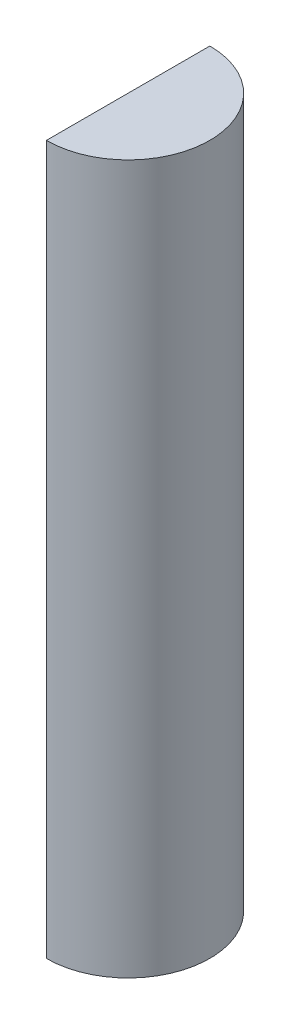
ISO-10303-21;
HEADER;
FILE_DESCRIPTION(('STEP AP214'),'2;1');
FILE_NAME('part.step','',(''),(''),'','','');
FILE_SCHEMA(('AUTOMOTIVE_DESIGN { 1 0 10303 214 1 1 1 1 }'));
ENDSEC;
DATA;
#1=APPLICATION_CONTEXT('core data for automotive mechanical design processes');
#2=APPLICATION_PROTOCOL_DEFINITION('international standard','automotive_design',2000,#1);
#3=PRODUCT_CONTEXT('',#1,'mechanical');
#4=PRODUCT('Part','Part','',(#3));
#5=PRODUCT_RELATED_PRODUCT_CATEGORY('part','',(#4));
#6=PRODUCT_DEFINITION_FORMATION('','',#4);
#7=PRODUCT_DEFINITION_CONTEXT('part definition',#1,'design');
#8=PRODUCT_DEFINITION('design','',#6,#7);
#9=PRODUCT_DEFINITION_SHAPE('','',#8);
#10=(LENGTH_UNIT() NAMED_UNIT(*) SI_UNIT(.MILLI.,.METRE.));
#11=(NAMED_UNIT(*) PLANE_ANGLE_UNIT() SI_UNIT($,.RADIAN.));
#12=(NAMED_UNIT(*) SI_UNIT($,.STERADIAN.) SOLID_ANGLE_UNIT());
#13=UNCERTAINTY_MEASURE_WITH_UNIT(LENGTH_MEASURE(1.E-05),#10,'distance_accuracy_value','');
#14=(GEOMETRIC_REPRESENTATION_CONTEXT(3) GLOBAL_UNCERTAINTY_ASSIGNED_CONTEXT((#13)) GLOBAL_UNIT_ASSIGNED_CONTEXT((#10,
#11,#12)) REPRESENTATION_CONTEXT('',''));
#15=CARTESIAN_POINT('',(0.,0.,0.));
#16=DIRECTION('',(0.,0.,1.));
#17=DIRECTION('',(1.,0.,0.));
#18=AXIS2_PLACEMENT_3D('',#15,#16,#17);
#19=CARTESIAN_POINT('',(1.524,19.05,6.35));
#20=DIRECTION('',(0.,1.,0.));
#21=DIRECTION('',(0.,0.,1.));
#22=AXIS2_PLACEMENT_3D('',#19,#20,#21);
#23=PLANE('',#22);
#24=DIRECTION('',(0.,0.,1.));
#25=VECTOR('',#24,1.);
#26=CARTESIAN_POINT('',(1.524,19.05,8.73125));
#27=LINE('',#26,#25);
#28=CARTESIAN_POINT('',(1.524,19.05,3.96875));
#29=VERTEX_POINT('',#28);
#30=CARTESIAN_POINT('',(1.524,19.05,8.73125));
#31=VERTEX_POINT('',#30);
#32=EDGE_CURVE('E56',#29,#31,#27,.T.);
#33=ORIENTED_EDGE('',*,*,#32,.T.);
#34=CARTESIAN_POINT('',(1.524,19.05,6.35));
#35=DIRECTION('',(0.,-1.,0.));
#36=DIRECTION('',(0.,0.,-1.));
#37=AXIS2_PLACEMENT_3D('',#34,#35,#36);
#38=CIRCLE('',#37,2.38125);
#39=EDGE_CURVE('E45',#29,#31,#38,.T.);
#40=ORIENTED_EDGE('',*,*,#39,.F.);
#41=EDGE_LOOP('',(#33,#40));
#42=FACE_BOUND('',#41,.T.);
#43=ADVANCED_FACE('F37',(#42),#23,.T.);
#44=CARTESIAN_POINT('',(1.524,19.05,6.35));
#45=DIRECTION('',(0.,-1.,0.));
#46=DIRECTION('',(0.,0.,-1.));
#47=AXIS2_PLACEMENT_3D('',#44,#45,#46);
#48=CYLINDRICAL_SURFACE('',#47,2.38125);
#49=CARTESIAN_POINT('',(1.524,-1.5875,6.35));
#50=DIRECTION('',(0.,-1.,0.));
#51=DIRECTION('',(0.,0.,-1.));
#52=AXIS2_PLACEMENT_3D('',#49,#50,#51);
#53=CIRCLE('',#52,2.38125);
#54=CARTESIAN_POINT('',(1.524,-1.5875,3.96875));
#55=VERTEX_POINT('',#54);
#56=CARTESIAN_POINT('',(1.524,-1.5875,8.73125));
#57=VERTEX_POINT('',#56);
#58=EDGE_CURVE('E69',#55,#57,#53,.T.);
#59=ORIENTED_EDGE('',*,*,#58,.F.);
#60=DIRECTION('',(0.,-1.,0.));
#61=VECTOR('',#60,1.);
#62=CARTESIAN_POINT('',(1.524,19.05,3.96875));
#63=LINE('',#62,#61);
#64=EDGE_CURVE('E51',#55,#29,#63,.F.);
#65=ORIENTED_EDGE('',*,*,#64,.T.);
#66=ORIENTED_EDGE('',*,*,#39,.T.);
#67=DIRECTION('',(0.,-1.,0.));
#68=VECTOR('',#67,1.);
#69=CARTESIAN_POINT('',(1.524,19.05,8.73125));
#70=LINE('',#69,#68);
#71=EDGE_CURVE('E62',#31,#57,#70,.T.);
#72=ORIENTED_EDGE('',*,*,#71,.T.);
#73=EDGE_LOOP('',(#59,#65,#66,#72));
#74=FACE_BOUND('',#73,.T.);
#75=ADVANCED_FACE('F68',(#74),#48,.T.);
#76=CARTESIAN_POINT('',(1.524,-1.5875,6.35));
#77=DIRECTION('',(0.,-1.,0.));
#78=DIRECTION('',(0.,0.,-1.));
#79=AXIS2_PLACEMENT_3D('',#76,#77,#78);
#80=PLANE('',#79);
#81=DIRECTION('',(0.,0.,1.));
#82=VECTOR('',#81,1.);
#83=CARTESIAN_POINT('',(1.524,-1.5875,6.35));
#84=LINE('',#83,#82);
#85=EDGE_CURVE('E11',#55,#57,#84,.T.);
#86=ORIENTED_EDGE('',*,*,#85,.F.);
#87=ORIENTED_EDGE('',*,*,#58,.T.);
#88=EDGE_LOOP('',(#86,#87));
#89=FACE_BOUND('',#88,.T.);
#90=ADVANCED_FACE('F39',(#89),#80,.T.);
#91=CARTESIAN_POINT('',(1.524,19.05,8.73125));
#92=DIRECTION('',(1.,0.,0.));
#93=DIRECTION('',(0.,0.,-1.));
#94=AXIS2_PLACEMENT_3D('',#91,#92,#93);
#95=PLANE('',#94);
#96=ORIENTED_EDGE('',*,*,#85,.T.);
#97=ORIENTED_EDGE('',*,*,#71,.F.);
#98=ORIENTED_EDGE('',*,*,#32,.F.);
#99=ORIENTED_EDGE('',*,*,#64,.F.);
#100=EDGE_LOOP('',(#96,#97,#98,#99));
#101=FACE_BOUND('',#100,.T.);
#102=ADVANCED_FACE('F61',(#101),#95,.F.);
#103=CLOSED_SHELL('',(#43,#75,#90,#102));
#104=MANIFOLD_SOLID_BREP('B2',#103);
#105=ADVANCED_BREP_SHAPE_REPRESENTATION('',(#18,#104),#14);
#106=SHAPE_DEFINITION_REPRESENTATION(#9,#105);
ENDSEC;
END-ISO-10303-21;
